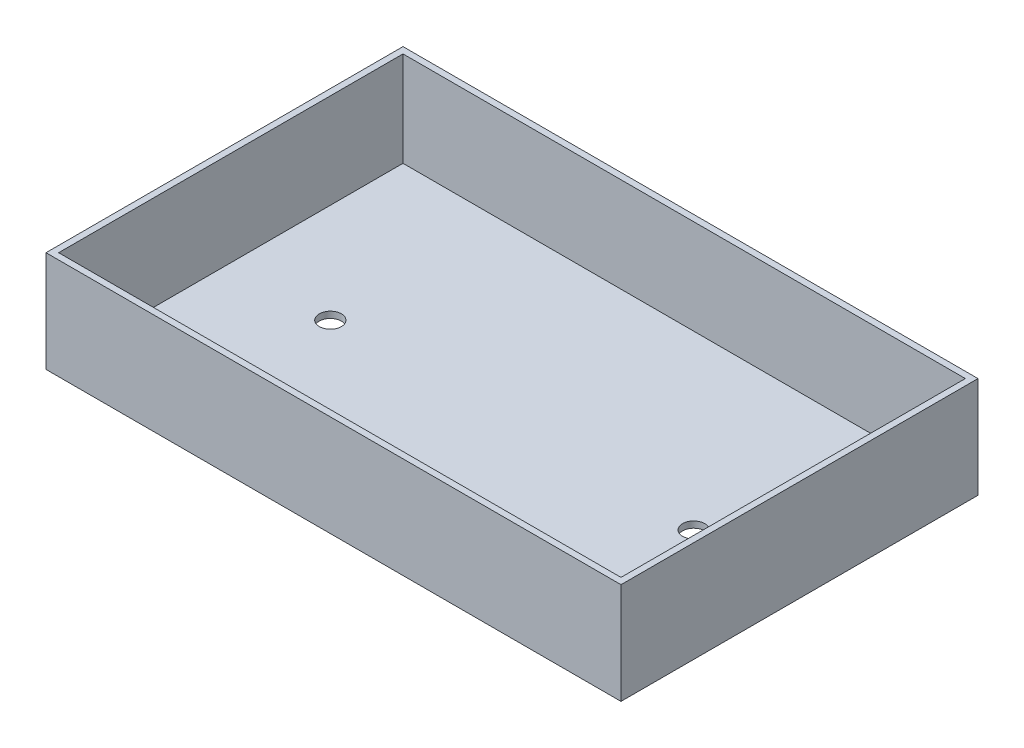
ISO-10303-21;
HEADER;
FILE_DESCRIPTION(('STEP AP214'),'2;1');
FILE_NAME('part.step','',(''),(''),'','','');
FILE_SCHEMA(('AUTOMOTIVE_DESIGN { 1 0 10303 214 1 1 1 1 }'));
ENDSEC;
DATA;
#1=APPLICATION_CONTEXT('core data for automotive mechanical design processes');
#2=APPLICATION_PROTOCOL_DEFINITION('international standard','automotive_design',2000,#1);
#3=PRODUCT_CONTEXT('',#1,'mechanical');
#4=PRODUCT('Part','Part','',(#3));
#5=PRODUCT_RELATED_PRODUCT_CATEGORY('part','',(#4));
#6=PRODUCT_DEFINITION_FORMATION('','',#4);
#7=PRODUCT_DEFINITION_CONTEXT('part definition',#1,'design');
#8=PRODUCT_DEFINITION('design','',#6,#7);
#9=PRODUCT_DEFINITION_SHAPE('','',#8);
#10=(LENGTH_UNIT() NAMED_UNIT(*) SI_UNIT(.MILLI.,.METRE.));
#11=(NAMED_UNIT(*) PLANE_ANGLE_UNIT() SI_UNIT($,.RADIAN.));
#12=(NAMED_UNIT(*) SI_UNIT($,.STERADIAN.) SOLID_ANGLE_UNIT());
#13=UNCERTAINTY_MEASURE_WITH_UNIT(LENGTH_MEASURE(1.E-05),#10,'distance_accuracy_value','');
#14=(GEOMETRIC_REPRESENTATION_CONTEXT(3) GLOBAL_UNCERTAINTY_ASSIGNED_CONTEXT((#13)) GLOBAL_UNIT_ASSIGNED_CONTEXT((#10,
#11,#12)) REPRESENTATION_CONTEXT('',''));
#15=CARTESIAN_POINT('',(0.,0.,0.));
#16=DIRECTION('',(0.,0.,1.));
#17=DIRECTION('',(1.,0.,0.));
#18=AXIS2_PLACEMENT_3D('',#15,#16,#17);
#19=CARTESIAN_POINT('',(0.,16.,0.));
#20=DIRECTION('',(1.,0.,0.));
#21=DIRECTION('',(0.,0.,-1.));
#22=AXIS2_PLACEMENT_3D('',#19,#20,#21);
#23=PLANE('',#22);
#24=DIRECTION('',(0.,0.,1.));
#25=VECTOR('',#24,1.);
#26=CARTESIAN_POINT('',(0.,0.,0.));
#27=LINE('',#26,#25);
#28=CARTESIAN_POINT('',(0.,0.,-56.5));
#29=VERTEX_POINT('',#28);
#30=CARTESIAN_POINT('',(0.,0.,0.));
#31=VERTEX_POINT('',#30);
#32=EDGE_CURVE('E144',#29,#31,#27,.T.);
#33=ORIENTED_EDGE('',*,*,#32,.T.);
#34=DIRECTION('',(0.,-1.,0.));
#35=VECTOR('',#34,1.);
#36=CARTESIAN_POINT('',(0.,16.,0.));
#37=LINE('',#36,#35);
#38=CARTESIAN_POINT('',(0.,16.,0.));
#39=VERTEX_POINT('',#38);
#40=EDGE_CURVE('E11',#39,#31,#37,.T.);
#41=ORIENTED_EDGE('',*,*,#40,.F.);
#42=DIRECTION('',(0.,0.,1.));
#43=VECTOR('',#42,1.);
#44=CARTESIAN_POINT('',(0.,16.,0.));
#45=LINE('',#44,#43);
#46=CARTESIAN_POINT('',(0.,16.,-56.5));
#47=VERTEX_POINT('',#46);
#48=EDGE_CURVE('E148',#47,#39,#45,.T.);
#49=ORIENTED_EDGE('',*,*,#48,.F.);
#50=DIRECTION('',(0.,-1.,0.));
#51=VECTOR('',#50,1.);
#52=CARTESIAN_POINT('',(0.,16.,-56.5));
#53=LINE('',#52,#51);
#54=EDGE_CURVE('E154',#47,#29,#53,.T.);
#55=ORIENTED_EDGE('',*,*,#54,.T.);
#56=EDGE_LOOP('',(#33,#41,#49,#55));
#57=FACE_BOUND('',#56,.T.);
#58=ADVANCED_FACE('F33',(#57),#23,.F.);
#59=CARTESIAN_POINT('',(0.,16.,0.));
#60=DIRECTION('',(0.,0.,-1.));
#61=DIRECTION('',(-1.,0.,0.));
#62=AXIS2_PLACEMENT_3D('',#59,#60,#61);
#63=PLANE('',#62);
#64=DIRECTION('',(1.,0.,0.));
#65=VECTOR('',#64,1.);
#66=CARTESIAN_POINT('',(0.,0.,0.));
#67=LINE('',#66,#65);
#68=CARTESIAN_POINT('',(91.,0.,0.));
#69=VERTEX_POINT('',#68);
#70=EDGE_CURVE('E157',#31,#69,#67,.T.);
#71=ORIENTED_EDGE('',*,*,#70,.T.);
#72=DIRECTION('',(0.,-1.,0.));
#73=VECTOR('',#72,1.);
#74=CARTESIAN_POINT('',(91.,16.,0.));
#75=LINE('',#74,#73);
#76=CARTESIAN_POINT('',(91.,16.,0.));
#77=VERTEX_POINT('',#76);
#78=EDGE_CURVE('E40',#77,#69,#75,.T.);
#79=ORIENTED_EDGE('',*,*,#78,.F.);
#80=DIRECTION('',(1.,0.,0.));
#81=VECTOR('',#80,1.);
#82=CARTESIAN_POINT('',(0.,16.,0.));
#83=LINE('',#82,#81);
#84=EDGE_CURVE('E84',#39,#77,#83,.T.);
#85=ORIENTED_EDGE('',*,*,#84,.F.);
#86=ORIENTED_EDGE('',*,*,#40,.T.);
#87=EDGE_LOOP('',(#71,#79,#85,#86));
#88=FACE_BOUND('',#87,.T.);
#89=ADVANCED_FACE('F186',(#88),#63,.F.);
#90=CARTESIAN_POINT('',(91.,16.,0.));
#91=DIRECTION('',(-1.,0.,0.));
#92=DIRECTION('',(0.,0.,1.));
#93=AXIS2_PLACEMENT_3D('',#90,#91,#92);
#94=PLANE('',#93);
#95=DIRECTION('',(0.,0.,-1.));
#96=VECTOR('',#95,1.);
#97=CARTESIAN_POINT('',(91.,0.,0.));
#98=LINE('',#97,#96);
#99=CARTESIAN_POINT('',(91.,0.,-56.5));
#100=VERTEX_POINT('',#99);
#101=EDGE_CURVE('E159',#69,#100,#98,.T.);
#102=ORIENTED_EDGE('',*,*,#101,.T.);
#103=DIRECTION('',(0.,-1.,0.));
#104=VECTOR('',#103,1.);
#105=CARTESIAN_POINT('',(91.,16.,-56.5));
#106=LINE('',#105,#104);
#107=CARTESIAN_POINT('',(91.,16.,-56.5));
#108=VERTEX_POINT('',#107);
#109=EDGE_CURVE('E163',#108,#100,#106,.T.);
#110=ORIENTED_EDGE('',*,*,#109,.F.);
#111=DIRECTION('',(0.,0.,-1.));
#112=VECTOR('',#111,1.);
#113=CARTESIAN_POINT('',(91.,16.,0.));
#114=LINE('',#113,#112);
#115=EDGE_CURVE('E151',#77,#108,#114,.T.);
#116=ORIENTED_EDGE('',*,*,#115,.F.);
#117=ORIENTED_EDGE('',*,*,#78,.T.);
#118=EDGE_LOOP('',(#102,#110,#116,#117));
#119=FACE_BOUND('',#118,.T.);
#120=ADVANCED_FACE('F168',(#119),#94,.F.);
#121=CARTESIAN_POINT('',(0.,16.,-56.5));
#122=DIRECTION('',(0.,0.,1.));
#123=DIRECTION('',(1.,0.,0.));
#124=AXIS2_PLACEMENT_3D('',#121,#122,#123);
#125=PLANE('',#124);
#126=DIRECTION('',(-1.,0.,0.));
#127=VECTOR('',#126,1.);
#128=CARTESIAN_POINT('',(0.,0.,-56.5));
#129=LINE('',#128,#127);
#130=EDGE_CURVE('E77',#100,#29,#129,.T.);
#131=ORIENTED_EDGE('',*,*,#130,.T.);
#132=ORIENTED_EDGE('',*,*,#54,.F.);
#133=DIRECTION('',(-1.,0.,0.));
#134=VECTOR('',#133,1.);
#135=CARTESIAN_POINT('',(0.,16.,-56.5));
#136=LINE('',#135,#134);
#137=EDGE_CURVE('E56',#108,#47,#136,.T.);
#138=ORIENTED_EDGE('',*,*,#137,.F.);
#139=ORIENTED_EDGE('',*,*,#109,.T.);
#140=EDGE_LOOP('',(#131,#132,#138,#139));
#141=FACE_BOUND('',#140,.T.);
#142=ADVANCED_FACE('F176',(#141),#125,.F.);
#143=CARTESIAN_POINT('',(0.,16.,0.));
#144=DIRECTION('',(0.,-1.,0.));
#145=DIRECTION('',(0.,0.,-1.));
#146=AXIS2_PLACEMENT_3D('',#143,#144,#145);
#147=PLANE('',#146);
#148=DIRECTION('',(1.,0.,0.));
#149=VECTOR('',#148,1.);
#150=CARTESIAN_POINT('',(1.,16.,-1.));
#151=LINE('',#150,#149);
#152=CARTESIAN_POINT('',(1.,16.,-1.));
#153=VERTEX_POINT('',#152);
#154=CARTESIAN_POINT('',(90.,16.,-1.));
#155=VERTEX_POINT('',#154);
#156=EDGE_CURVE('E138',#153,#155,#151,.T.);
#157=ORIENTED_EDGE('',*,*,#156,.F.);
#158=DIRECTION('',(0.,0.,1.));
#159=VECTOR('',#158,1.);
#160=CARTESIAN_POINT('',(1.,16.,-1.));
#161=LINE('',#160,#159);
#162=CARTESIAN_POINT('',(1.,16.,-55.5));
#163=VERTEX_POINT('',#162);
#164=EDGE_CURVE('E47',#163,#153,#161,.T.);
#165=ORIENTED_EDGE('',*,*,#164,.F.);
#166=DIRECTION('',(-1.,0.,0.));
#167=VECTOR('',#166,1.);
#168=CARTESIAN_POINT('',(1.,16.,-55.5));
#169=LINE('',#168,#167);
#170=CARTESIAN_POINT('',(90.,16.,-55.5));
#171=VERTEX_POINT('',#170);
#172=EDGE_CURVE('E126',#171,#163,#169,.T.);
#173=ORIENTED_EDGE('',*,*,#172,.F.);
#174=DIRECTION('',(0.,0.,-1.));
#175=VECTOR('',#174,1.);
#176=CARTESIAN_POINT('',(90.,16.,-1.));
#177=LINE('',#176,#175);
#178=EDGE_CURVE('E129',#155,#171,#177,.T.);
#179=ORIENTED_EDGE('',*,*,#178,.F.);
#180=EDGE_LOOP('',(#157,#165,#173,#179));
#181=FACE_BOUND('',#180,.T.);
#182=ORIENTED_EDGE('',*,*,#48,.T.);
#183=ORIENTED_EDGE('',*,*,#84,.T.);
#184=ORIENTED_EDGE('',*,*,#115,.T.);
#185=ORIENTED_EDGE('',*,*,#137,.T.);
#186=EDGE_LOOP('',(#182,#183,#184,#185));
#187=FACE_BOUND('',#186,.T.);
#188=ADVANCED_FACE('F178',(#181,#187),#147,.F.);
#189=CARTESIAN_POINT('',(0.,0.,0.));
#190=DIRECTION('',(0.,-1.,0.));
#191=DIRECTION('',(0.,0.,-1.));
#192=AXIS2_PLACEMENT_3D('',#189,#190,#191);
#193=PLANE('',#192);
#194=CARTESIAN_POINT('',(74.25,0.,-28.25));
#195=DIRECTION('',(0.,-1.,0.));
#196=DIRECTION('',(0.,0.,-1.));
#197=AXIS2_PLACEMENT_3D('',#194,#195,#196);
#198=CIRCLE('',#197,1.75);
#199=CARTESIAN_POINT('',(74.25,0.,-30.));
#200=VERTEX_POINT('',#199);
#201=EDGE_CURVE('E289',#200,#200,#198,.T.);
#202=ORIENTED_EDGE('',*,*,#201,.F.);
#203=EDGE_LOOP('',(#202));
#204=FACE_BOUND('',#203,.T.);
#205=CARTESIAN_POINT('',(16.75,0.,-28.25));
#206=DIRECTION('',(0.,-1.,0.));
#207=DIRECTION('',(0.,0.,-1.));
#208=AXIS2_PLACEMENT_3D('',#205,#206,#207);
#209=CIRCLE('',#208,1.75);
#210=CARTESIAN_POINT('',(16.75,0.,-30.));
#211=VERTEX_POINT('',#210);
#212=EDGE_CURVE('E132',#211,#211,#209,.T.);
#213=ORIENTED_EDGE('',*,*,#212,.F.);
#214=EDGE_LOOP('',(#213));
#215=FACE_BOUND('',#214,.T.);
#216=ORIENTED_EDGE('',*,*,#32,.F.);
#217=ORIENTED_EDGE('',*,*,#130,.F.);
#218=ORIENTED_EDGE('',*,*,#101,.F.);
#219=ORIENTED_EDGE('',*,*,#70,.F.);
#220=EDGE_LOOP('',(#216,#217,#218,#219));
#221=FACE_BOUND('',#220,.T.);
#222=ADVANCED_FACE('F172',(#204,#215,#221),#193,.T.);
#223=CARTESIAN_POINT('',(1.,1.,-1.));
#224=DIRECTION('',(-1.,0.,0.));
#225=DIRECTION('',(0.,0.,1.));
#226=AXIS2_PLACEMENT_3D('',#223,#224,#225);
#227=PLANE('',#226);
#228=ORIENTED_EDGE('',*,*,#164,.T.);
#229=DIRECTION('',(0.,1.,0.));
#230=VECTOR('',#229,1.);
#231=CARTESIAN_POINT('',(1.,1.,-1.));
#232=LINE('',#231,#230);
#233=CARTESIAN_POINT('',(1.,1.,-1.));
#234=VERTEX_POINT('',#233);
#235=EDGE_CURVE('E104',#234,#153,#232,.T.);
#236=ORIENTED_EDGE('',*,*,#235,.F.);
#237=DIRECTION('',(0.,0.,1.));
#238=VECTOR('',#237,1.);
#239=CARTESIAN_POINT('',(1.,1.,-1.));
#240=LINE('',#239,#238);
#241=CARTESIAN_POINT('',(1.,1.,-55.5));
#242=VERTEX_POINT('',#241);
#243=EDGE_CURVE('E108',#242,#234,#240,.T.);
#244=ORIENTED_EDGE('',*,*,#243,.F.);
#245=DIRECTION('',(0.,1.,0.));
#246=VECTOR('',#245,1.);
#247=CARTESIAN_POINT('',(1.,1.,-55.5));
#248=LINE('',#247,#246);
#249=EDGE_CURVE('E142',#242,#163,#248,.T.);
#250=ORIENTED_EDGE('',*,*,#249,.T.);
#251=EDGE_LOOP('',(#228,#236,#244,#250));
#252=FACE_BOUND('',#251,.T.);
#253=ADVANCED_FACE('F106',(#252),#227,.F.);
#254=CARTESIAN_POINT('',(1.,1.,-55.5));
#255=DIRECTION('',(0.,0.,-1.));
#256=DIRECTION('',(-1.,0.,0.));
#257=AXIS2_PLACEMENT_3D('',#254,#255,#256);
#258=PLANE('',#257);
#259=ORIENTED_EDGE('',*,*,#172,.T.);
#260=ORIENTED_EDGE('',*,*,#249,.F.);
#261=DIRECTION('',(-1.,0.,0.));
#262=VECTOR('',#261,1.);
#263=CARTESIAN_POINT('',(1.,1.,-55.5));
#264=LINE('',#263,#262);
#265=CARTESIAN_POINT('',(90.,1.,-55.5));
#266=VERTEX_POINT('',#265);
#267=EDGE_CURVE('E114',#266,#242,#264,.T.);
#268=ORIENTED_EDGE('',*,*,#267,.F.);
#269=DIRECTION('',(0.,1.,0.));
#270=VECTOR('',#269,1.);
#271=CARTESIAN_POINT('',(90.,1.,-55.5));
#272=LINE('',#271,#270);
#273=EDGE_CURVE('E145',#266,#171,#272,.T.);
#274=ORIENTED_EDGE('',*,*,#273,.T.);
#275=EDGE_LOOP('',(#259,#260,#268,#274));
#276=FACE_BOUND('',#275,.T.);
#277=ADVANCED_FACE('F220',(#276),#258,.F.);
#278=CARTESIAN_POINT('',(90.,1.,-1.));
#279=DIRECTION('',(1.,0.,0.));
#280=DIRECTION('',(0.,0.,-1.));
#281=AXIS2_PLACEMENT_3D('',#278,#279,#280);
#282=PLANE('',#281);
#283=ORIENTED_EDGE('',*,*,#178,.T.);
#284=ORIENTED_EDGE('',*,*,#273,.F.);
#285=DIRECTION('',(0.,0.,-1.));
#286=VECTOR('',#285,1.);
#287=CARTESIAN_POINT('',(90.,1.,-1.));
#288=LINE('',#287,#286);
#289=CARTESIAN_POINT('',(90.,1.,-1.));
#290=VERTEX_POINT('',#289);
#291=EDGE_CURVE('E122',#290,#266,#288,.T.);
#292=ORIENTED_EDGE('',*,*,#291,.F.);
#293=DIRECTION('',(0.,1.,0.));
#294=VECTOR('',#293,1.);
#295=CARTESIAN_POINT('',(90.,1.,-1.));
#296=LINE('',#295,#294);
#297=EDGE_CURVE('E113',#290,#155,#296,.T.);
#298=ORIENTED_EDGE('',*,*,#297,.T.);
#299=EDGE_LOOP('',(#283,#284,#292,#298));
#300=FACE_BOUND('',#299,.T.);
#301=ADVANCED_FACE('F229',(#300),#282,.F.);
#302=CARTESIAN_POINT('',(1.,1.,-1.));
#303=DIRECTION('',(0.,0.,1.));
#304=DIRECTION('',(1.,0.,0.));
#305=AXIS2_PLACEMENT_3D('',#302,#303,#304);
#306=PLANE('',#305);
#307=ORIENTED_EDGE('',*,*,#156,.T.);
#308=ORIENTED_EDGE('',*,*,#297,.F.);
#309=DIRECTION('',(1.,0.,0.));
#310=VECTOR('',#309,1.);
#311=CARTESIAN_POINT('',(1.,1.,-1.));
#312=LINE('',#311,#310);
#313=EDGE_CURVE('E117',#234,#290,#312,.T.);
#314=ORIENTED_EDGE('',*,*,#313,.F.);
#315=ORIENTED_EDGE('',*,*,#235,.T.);
#316=EDGE_LOOP('',(#307,#308,#314,#315));
#317=FACE_BOUND('',#316,.T.);
#318=ADVANCED_FACE('F118',(#317),#306,.F.);
#319=CARTESIAN_POINT('',(0.,1.,0.));
#320=DIRECTION('',(0.,-1.,0.));
#321=DIRECTION('',(0.,0.,-1.));
#322=AXIS2_PLACEMENT_3D('',#319,#320,#321);
#323=PLANE('',#322);
#324=CARTESIAN_POINT('',(74.25,1.,-28.25));
#325=DIRECTION('',(0.,1.,0.));
#326=DIRECTION('',(0.,0.,-1.));
#327=AXIS2_PLACEMENT_3D('',#324,#325,#326);
#328=CIRCLE('',#327,1.75);
#329=CARTESIAN_POINT('',(74.25,1.,-30.));
#330=VERTEX_POINT('',#329);
#331=EDGE_CURVE('E292',#330,#330,#328,.T.);
#332=ORIENTED_EDGE('',*,*,#331,.F.);
#333=EDGE_LOOP('',(#332));
#334=FACE_BOUND('',#333,.T.);
#335=CARTESIAN_POINT('',(16.75,1.,-28.25));
#336=DIRECTION('',(0.,1.,0.));
#337=DIRECTION('',(0.,0.,1.));
#338=AXIS2_PLACEMENT_3D('',#335,#336,#337);
#339=CIRCLE('',#338,1.75);
#340=CARTESIAN_POINT('',(16.75,1.,-26.5));
#341=VERTEX_POINT('',#340);
#342=EDGE_CURVE('E294',#341,#341,#339,.T.);
#343=ORIENTED_EDGE('',*,*,#342,.F.);
#344=EDGE_LOOP('',(#343));
#345=FACE_BOUND('',#344,.T.);
#346=ORIENTED_EDGE('',*,*,#243,.T.);
#347=ORIENTED_EDGE('',*,*,#313,.T.);
#348=ORIENTED_EDGE('',*,*,#291,.T.);
#349=ORIENTED_EDGE('',*,*,#267,.T.);
#350=EDGE_LOOP('',(#346,#347,#348,#349));
#351=FACE_BOUND('',#350,.T.);
#352=ADVANCED_FACE('F124',(#334,#345,#351),#323,.F.);
#353=CARTESIAN_POINT('',(16.75,-14.,-28.25));
#354=DIRECTION('',(0.,1.,0.));
#355=DIRECTION('',(0.,0.,1.));
#356=AXIS2_PLACEMENT_3D('',#353,#354,#355);
#357=CYLINDRICAL_SURFACE('',#356,1.75);
#358=ORIENTED_EDGE('',*,*,#212,.T.);
#359=EDGE_LOOP('',(#358));
#360=FACE_BOUND('',#359,.T.);
#361=ORIENTED_EDGE('',*,*,#342,.T.);
#362=EDGE_LOOP('',(#361));
#363=FACE_BOUND('',#362,.T.);
#364=ADVANCED_FACE('F262',(#360,#363),#357,.F.);
#365=CARTESIAN_POINT('',(74.25,-14.,-28.25));
#366=DIRECTION('',(0.,1.,0.));
#367=DIRECTION('',(0.,0.,1.));
#368=AXIS2_PLACEMENT_3D('',#365,#366,#367);
#369=CYLINDRICAL_SURFACE('',#368,1.75);
#370=ORIENTED_EDGE('',*,*,#201,.T.);
#371=EDGE_LOOP('',(#370));
#372=FACE_BOUND('',#371,.T.);
#373=ORIENTED_EDGE('',*,*,#331,.T.);
#374=EDGE_LOOP('',(#373));
#375=FACE_BOUND('',#374,.T.);
#376=ADVANCED_FACE('F272',(#372,#375),#369,.F.);
#377=CLOSED_SHELL('',(#58,#89,#120,#142,#188,#222,#253,#277,#301,#318,#352,#364,#376));
#378=MANIFOLD_SOLID_BREP('B2',#377);
#379=ADVANCED_BREP_SHAPE_REPRESENTATION('',(#18,#378),#14);
#380=SHAPE_DEFINITION_REPRESENTATION(#9,#379);
ENDSEC;
END-ISO-10303-21;
